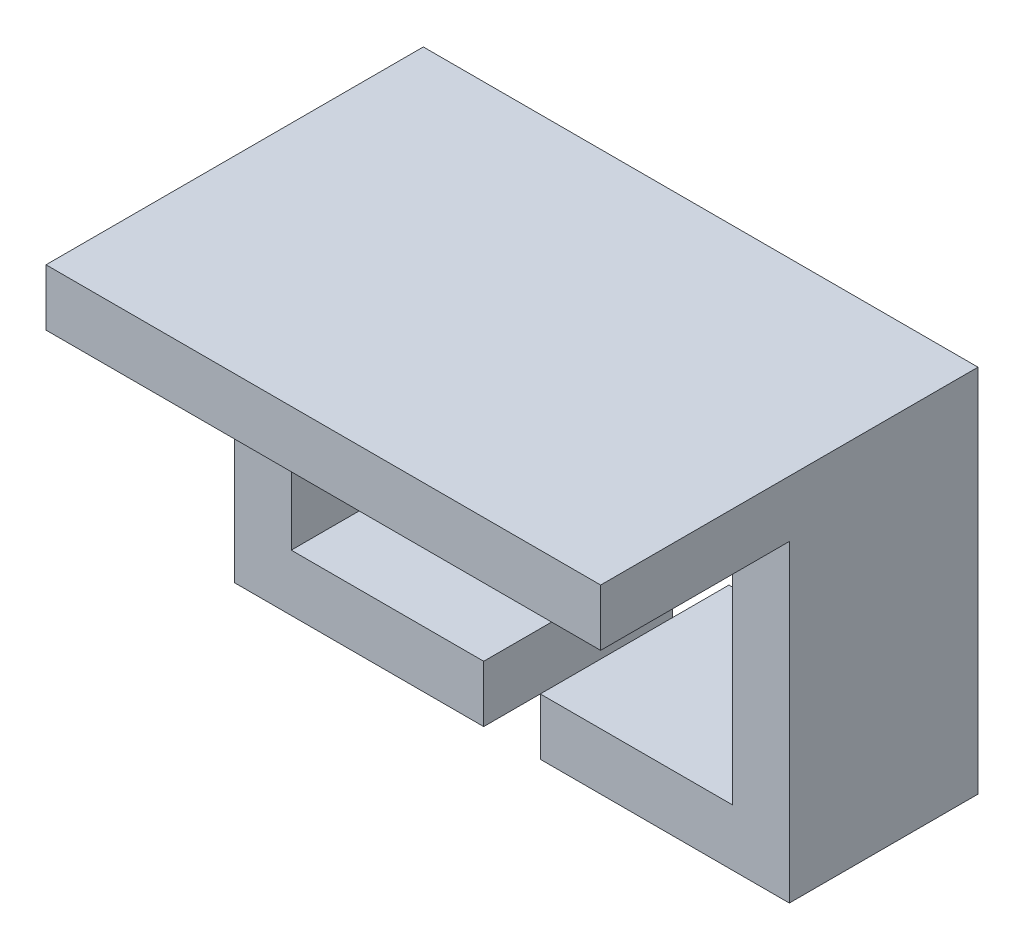
ISO-10303-21;
HEADER;
FILE_DESCRIPTION(('STEP AP214'),'2;1');
FILE_NAME('part.step','',(''),(''),'','','');
FILE_SCHEMA(('AUTOMOTIVE_DESIGN { 1 0 10303 214 1 1 1 1 }'));
ENDSEC;
DATA;
#1=APPLICATION_CONTEXT('core data for automotive mechanical design processes');
#2=APPLICATION_PROTOCOL_DEFINITION('international standard','automotive_design',2000,#1);
#3=PRODUCT_CONTEXT('',#1,'mechanical');
#4=PRODUCT('Part','Part','',(#3));
#5=PRODUCT_RELATED_PRODUCT_CATEGORY('part','',(#4));
#6=PRODUCT_DEFINITION_FORMATION('','',#4);
#7=PRODUCT_DEFINITION_CONTEXT('part definition',#1,'design');
#8=PRODUCT_DEFINITION('design','',#6,#7);
#9=PRODUCT_DEFINITION_SHAPE('','',#8);
#10=(LENGTH_UNIT() NAMED_UNIT(*) SI_UNIT(.MILLI.,.METRE.));
#11=(NAMED_UNIT(*) PLANE_ANGLE_UNIT() SI_UNIT($,.RADIAN.));
#12=(NAMED_UNIT(*) SI_UNIT($,.STERADIAN.) SOLID_ANGLE_UNIT());
#13=UNCERTAINTY_MEASURE_WITH_UNIT(LENGTH_MEASURE(1.E-05),#10,'distance_accuracy_value','');
#14=(GEOMETRIC_REPRESENTATION_CONTEXT(3) GLOBAL_UNCERTAINTY_ASSIGNED_CONTEXT((#13)) GLOBAL_UNIT_ASSIGNED_CONTEXT((#10,
#11,#12)) REPRESENTATION_CONTEXT('',''));
#15=CARTESIAN_POINT('',(0.,0.,0.));
#16=DIRECTION('',(0.,0.,1.));
#17=DIRECTION('',(1.,0.,0.));
#18=AXIS2_PLACEMENT_3D('',#15,#16,#17);
#19=CARTESIAN_POINT('',(0.,0.,5.));
#20=DIRECTION('',(0.,0.,-1.));
#21=DIRECTION('',(-1.,0.,0.));
#22=AXIS2_PLACEMENT_3D('',#19,#20,#21);
#23=PLANE('',#22);
#24=DIRECTION('',(1.,0.,0.));
#25=VECTOR('',#24,1.);
#26=CARTESIAN_POINT('',(-7.35,3.4,5.));
#27=LINE('',#26,#25);
#28=CARTESIAN_POINT('',(-7.35,3.4,5.));
#29=VERTEX_POINT('',#28);
#30=CARTESIAN_POINT('',(-5.85,3.4,5.));
#31=VERTEX_POINT('',#30);
#32=EDGE_CURVE('E45',#29,#31,#27,.T.);
#33=ORIENTED_EDGE('',*,*,#32,.F.);
#34=DIRECTION('',(0.,-1.,0.));
#35=VECTOR('',#34,1.);
#36=CARTESIAN_POINT('',(-7.35,4.9,5.));
#37=LINE('',#36,#35);
#38=CARTESIAN_POINT('',(-7.35,-4.9,5.));
#39=VERTEX_POINT('',#38);
#40=EDGE_CURVE('E178',#29,#39,#37,.T.);
#41=ORIENTED_EDGE('',*,*,#40,.T.);
#42=DIRECTION('',(1.,0.,0.));
#43=VECTOR('',#42,1.);
#44=CARTESIAN_POINT('',(-7.35,-4.9,5.));
#45=LINE('',#44,#43);
#46=CARTESIAN_POINT('',(-0.749999999999999,-4.9,5.));
#47=VERTEX_POINT('',#46);
#48=EDGE_CURVE('E180',#39,#47,#45,.T.);
#49=ORIENTED_EDGE('',*,*,#48,.T.);
#50=DIRECTION('',(0.,1.,0.));
#51=VECTOR('',#50,1.);
#52=CARTESIAN_POINT('',(-0.749999999999999,-3.4,5.));
#53=LINE('',#52,#51);
#54=CARTESIAN_POINT('',(-0.749999999999999,-3.4,5.));
#55=VERTEX_POINT('',#54);
#56=EDGE_CURVE('E182',#47,#55,#53,.T.);
#57=ORIENTED_EDGE('',*,*,#56,.T.);
#58=DIRECTION('',(-1.,0.,0.));
#59=VECTOR('',#58,1.);
#60=CARTESIAN_POINT('',(-5.85,-3.4,5.));
#61=LINE('',#60,#59);
#62=CARTESIAN_POINT('',(-5.85,-3.4,5.));
#63=VERTEX_POINT('',#62);
#64=EDGE_CURVE('E137',#55,#63,#61,.T.);
#65=ORIENTED_EDGE('',*,*,#64,.T.);
#66=DIRECTION('',(0.,1.,0.));
#67=VECTOR('',#66,1.);
#68=CARTESIAN_POINT('',(-5.85,3.4,5.));
#69=LINE('',#68,#67);
#70=EDGE_CURVE('E134',#63,#31,#69,.T.);
#71=ORIENTED_EDGE('',*,*,#70,.T.);
#72=EDGE_LOOP('',(#33,#41,#49,#57,#65,#71));
#73=FACE_BOUND('',#72,.T.);
#74=ADVANCED_FACE('F35',(#73),#23,.F.);
#75=CARTESIAN_POINT('',(5.85,3.4,5.));
#76=VERTEX_POINT('',#75);
#77=CARTESIAN_POINT('',(7.35,3.4,5.));
#78=VERTEX_POINT('',#77);
#79=EDGE_CURVE('E11',#76,#78,#27,.T.);
#80=ORIENTED_EDGE('',*,*,#79,.F.);
#81=DIRECTION('',(0.,-1.,0.));
#82=VECTOR('',#81,1.);
#83=CARTESIAN_POINT('',(5.85,3.4,5.));
#84=LINE('',#83,#82);
#85=CARTESIAN_POINT('',(5.85,-3.4,5.));
#86=VERTEX_POINT('',#85);
#87=EDGE_CURVE('E60',#76,#86,#84,.T.);
#88=ORIENTED_EDGE('',*,*,#87,.T.);
#89=DIRECTION('',(-1.,0.,0.));
#90=VECTOR('',#89,1.);
#91=CARTESIAN_POINT('',(0.750000000000001,-3.4,5.));
#92=LINE('',#91,#90);
#93=CARTESIAN_POINT('',(0.750000000000001,-3.4,5.));
#94=VERTEX_POINT('',#93);
#95=EDGE_CURVE('E170',#86,#94,#92,.T.);
#96=ORIENTED_EDGE('',*,*,#95,.T.);
#97=DIRECTION('',(0.,-1.,0.));
#98=VECTOR('',#97,1.);
#99=CARTESIAN_POINT('',(0.750000000000001,-3.4,5.));
#100=LINE('',#99,#98);
#101=CARTESIAN_POINT('',(0.750000000000001,-4.9,5.));
#102=VERTEX_POINT('',#101);
#103=EDGE_CURVE('E114',#94,#102,#100,.T.);
#104=ORIENTED_EDGE('',*,*,#103,.T.);
#105=DIRECTION('',(1.,0.,0.));
#106=VECTOR('',#105,1.);
#107=CARTESIAN_POINT('',(0.750000000000001,-4.9,5.));
#108=LINE('',#107,#106);
#109=CARTESIAN_POINT('',(7.35,-4.9,5.));
#110=VERTEX_POINT('',#109);
#111=EDGE_CURVE('E173',#102,#110,#108,.T.);
#112=ORIENTED_EDGE('',*,*,#111,.T.);
#113=DIRECTION('',(0.,1.,0.));
#114=VECTOR('',#113,1.);
#115=CARTESIAN_POINT('',(7.35,4.9,5.));
#116=LINE('',#115,#114);
#117=EDGE_CURVE('E175',#110,#78,#116,.T.);
#118=ORIENTED_EDGE('',*,*,#117,.T.);
#119=EDGE_LOOP('',(#80,#88,#96,#104,#112,#118));
#120=FACE_BOUND('',#119,.T.);
#121=ADVANCED_FACE('F251',(#120),#23,.F.);
#122=CARTESIAN_POINT('',(0.750000000000001,-3.4,5.));
#123=DIRECTION('',(0.,-1.,0.));
#124=DIRECTION('',(0.,0.,-1.));
#125=AXIS2_PLACEMENT_3D('',#122,#123,#124);
#126=PLANE('',#125);
#127=DIRECTION('',(-1.,0.,0.));
#128=VECTOR('',#127,1.);
#129=CARTESIAN_POINT('',(0.750000000000001,-3.4,0.));
#130=LINE('',#129,#128);
#131=CARTESIAN_POINT('',(5.85,-3.4,0.));
#132=VERTEX_POINT('',#131);
#133=CARTESIAN_POINT('',(0.750000000000001,-3.4,0.));
#134=VERTEX_POINT('',#133);
#135=EDGE_CURVE('E169',#132,#134,#130,.T.);
#136=ORIENTED_EDGE('',*,*,#135,.T.);
#137=DIRECTION('',(0.,0.,-1.));
#138=VECTOR('',#137,1.);
#139=CARTESIAN_POINT('',(0.750000000000001,-3.4,5.));
#140=LINE('',#139,#138);
#141=EDGE_CURVE('E39',#94,#134,#140,.T.);
#142=ORIENTED_EDGE('',*,*,#141,.F.);
#143=ORIENTED_EDGE('',*,*,#95,.F.);
#144=DIRECTION('',(0.,0.,-1.));
#145=VECTOR('',#144,1.);
#146=CARTESIAN_POINT('',(5.85,-3.4,5.));
#147=LINE('',#146,#145);
#148=EDGE_CURVE('E186',#86,#132,#147,.T.);
#149=ORIENTED_EDGE('',*,*,#148,.T.);
#150=EDGE_LOOP('',(#136,#142,#143,#149));
#151=FACE_BOUND('',#150,.T.);
#152=ADVANCED_FACE('F37',(#151),#126,.F.);
#153=CARTESIAN_POINT('',(0.750000000000001,-3.4,5.));
#154=DIRECTION('',(1.,0.,0.));
#155=DIRECTION('',(0.,1.,0.));
#156=AXIS2_PLACEMENT_3D('',#153,#154,#155);
#157=PLANE('',#156);
#158=DIRECTION('',(0.,-1.,0.));
#159=VECTOR('',#158,1.);
#160=CARTESIAN_POINT('',(0.750000000000001,-3.4,0.));
#161=LINE('',#160,#159);
#162=CARTESIAN_POINT('',(0.750000000000001,-4.9,0.));
#163=VERTEX_POINT('',#162);
#164=EDGE_CURVE('E189',#134,#163,#161,.T.);
#165=ORIENTED_EDGE('',*,*,#164,.T.);
#166=DIRECTION('',(0.,0.,-1.));
#167=VECTOR('',#166,1.);
#168=CARTESIAN_POINT('',(0.750000000000001,-4.9,5.));
#169=LINE('',#168,#167);
#170=EDGE_CURVE('E229',#102,#163,#169,.T.);
#171=ORIENTED_EDGE('',*,*,#170,.F.);
#172=ORIENTED_EDGE('',*,*,#103,.F.);
#173=ORIENTED_EDGE('',*,*,#141,.T.);
#174=EDGE_LOOP('',(#165,#171,#172,#173));
#175=FACE_BOUND('',#174,.T.);
#176=ADVANCED_FACE('F235',(#175),#157,.F.);
#177=CARTESIAN_POINT('',(0.750000000000001,-4.9,5.));
#178=DIRECTION('',(0.,1.,0.));
#179=DIRECTION('',(0.,0.,1.));
#180=AXIS2_PLACEMENT_3D('',#177,#178,#179);
#181=PLANE('',#180);
#182=DIRECTION('',(1.,0.,0.));
#183=VECTOR('',#182,1.);
#184=CARTESIAN_POINT('',(0.750000000000001,-4.9,0.));
#185=LINE('',#184,#183);
#186=CARTESIAN_POINT('',(7.35,-4.9,0.));
#187=VERTEX_POINT('',#186);
#188=EDGE_CURVE('E191',#163,#187,#185,.T.);
#189=ORIENTED_EDGE('',*,*,#188,.T.);
#190=DIRECTION('',(0.,0.,-1.));
#191=VECTOR('',#190,1.);
#192=CARTESIAN_POINT('',(7.35,-4.9,5.));
#193=LINE('',#192,#191);
#194=EDGE_CURVE('E227',#110,#187,#193,.T.);
#195=ORIENTED_EDGE('',*,*,#194,.F.);
#196=ORIENTED_EDGE('',*,*,#111,.F.);
#197=ORIENTED_EDGE('',*,*,#170,.T.);
#198=EDGE_LOOP('',(#189,#195,#196,#197));
#199=FACE_BOUND('',#198,.T.);
#200=ADVANCED_FACE('F244',(#199),#181,.F.);
#201=CARTESIAN_POINT('',(7.35,4.9,5.));
#202=DIRECTION('',(-1.,0.,0.));
#203=DIRECTION('',(0.,0.,1.));
#204=AXIS2_PLACEMENT_3D('',#201,#202,#203);
#205=PLANE('',#204);
#206=DIRECTION('',(0.,1.,0.));
#207=VECTOR('',#206,1.);
#208=CARTESIAN_POINT('',(7.35,4.9,0.));
#209=LINE('',#208,#207);
#210=CARTESIAN_POINT('',(7.35,4.9,0.));
#211=VERTEX_POINT('',#210);
#212=EDGE_CURVE('E193',#187,#211,#209,.T.);
#213=ORIENTED_EDGE('',*,*,#212,.T.);
#214=DIRECTION('',(0.,0.,-1.));
#215=VECTOR('',#214,1.);
#216=CARTESIAN_POINT('',(7.35,4.9,5.));
#217=LINE('',#216,#215);
#218=CARTESIAN_POINT('',(7.35,4.9,10.));
#219=VERTEX_POINT('',#218);
#220=EDGE_CURVE('E224',#219,#211,#217,.T.);
#221=ORIENTED_EDGE('',*,*,#220,.F.);
#222=DIRECTION('',(0.,-1.,0.));
#223=VECTOR('',#222,1.);
#224=CARTESIAN_POINT('',(7.35,4.9,10.));
#225=LINE('',#224,#223);
#226=CARTESIAN_POINT('',(7.35,3.4,10.));
#227=VERTEX_POINT('',#226);
#228=EDGE_CURVE('E159',#219,#227,#225,.T.);
#229=ORIENTED_EDGE('',*,*,#228,.T.);
#230=DIRECTION('',(0.,0.,-1.));
#231=VECTOR('',#230,1.);
#232=CARTESIAN_POINT('',(7.35,3.4,10.));
#233=LINE('',#232,#231);
#234=EDGE_CURVE('E166',#227,#78,#233,.T.);
#235=ORIENTED_EDGE('',*,*,#234,.T.);
#236=ORIENTED_EDGE('',*,*,#117,.F.);
#237=ORIENTED_EDGE('',*,*,#194,.T.);
#238=EDGE_LOOP('',(#213,#221,#229,#235,#236,#237));
#239=FACE_BOUND('',#238,.T.);
#240=ADVANCED_FACE('F247',(#239),#205,.F.);
#241=CARTESIAN_POINT('',(-7.35,4.9,5.));
#242=DIRECTION('',(0.,-1.,0.));
#243=DIRECTION('',(0.,0.,-1.));
#244=AXIS2_PLACEMENT_3D('',#241,#242,#243);
#245=PLANE('',#244);
#246=DIRECTION('',(-1.,0.,0.));
#247=VECTOR('',#246,1.);
#248=CARTESIAN_POINT('',(-7.35,4.9,0.));
#249=LINE('',#248,#247);
#250=CARTESIAN_POINT('',(-7.35,4.9,0.));
#251=VERTEX_POINT('',#250);
#252=EDGE_CURVE('E195',#211,#251,#249,.T.);
#253=ORIENTED_EDGE('',*,*,#252,.T.);
#254=DIRECTION('',(0.,0.,-1.));
#255=VECTOR('',#254,1.);
#256=CARTESIAN_POINT('',(-7.35,4.9,5.));
#257=LINE('',#256,#255);
#258=CARTESIAN_POINT('',(-7.35,4.9,10.));
#259=VERTEX_POINT('',#258);
#260=EDGE_CURVE('E221',#259,#251,#257,.T.);
#261=ORIENTED_EDGE('',*,*,#260,.F.);
#262=DIRECTION('',(1.,0.,0.));
#263=VECTOR('',#262,1.);
#264=CARTESIAN_POINT('',(-7.35,4.9,10.));
#265=LINE('',#264,#263);
#266=EDGE_CURVE('E287',#259,#219,#265,.T.);
#267=ORIENTED_EDGE('',*,*,#266,.T.);
#268=ORIENTED_EDGE('',*,*,#220,.T.);
#269=EDGE_LOOP('',(#253,#261,#267,#268));
#270=FACE_BOUND('',#269,.T.);
#271=ADVANCED_FACE('F286',(#270),#245,.F.);
#272=CARTESIAN_POINT('',(-7.35,4.9,5.));
#273=DIRECTION('',(1.,0.,0.));
#274=DIRECTION('',(0.,1.,0.));
#275=AXIS2_PLACEMENT_3D('',#272,#273,#274);
#276=PLANE('',#275);
#277=DIRECTION('',(0.,-1.,0.));
#278=VECTOR('',#277,1.);
#279=CARTESIAN_POINT('',(-7.35,4.9,0.));
#280=LINE('',#279,#278);
#281=CARTESIAN_POINT('',(-7.35,-4.9,0.));
#282=VERTEX_POINT('',#281);
#283=EDGE_CURVE('E197',#251,#282,#280,.T.);
#284=ORIENTED_EDGE('',*,*,#283,.T.);
#285=DIRECTION('',(0.,0.,-1.));
#286=VECTOR('',#285,1.);
#287=CARTESIAN_POINT('',(-7.35,-4.9,5.));
#288=LINE('',#287,#286);
#289=EDGE_CURVE('E218',#39,#282,#288,.T.);
#290=ORIENTED_EDGE('',*,*,#289,.F.);
#291=ORIENTED_EDGE('',*,*,#40,.F.);
#292=DIRECTION('',(0.,0.,-1.));
#293=VECTOR('',#292,1.);
#294=CARTESIAN_POINT('',(-7.35,3.4,10.));
#295=LINE('',#294,#293);
#296=CARTESIAN_POINT('',(-7.35,3.4,10.));
#297=VERTEX_POINT('',#296);
#298=EDGE_CURVE('E156',#297,#29,#295,.T.);
#299=ORIENTED_EDGE('',*,*,#298,.F.);
#300=DIRECTION('',(0.,-1.,0.));
#301=VECTOR('',#300,1.);
#302=CARTESIAN_POINT('',(-7.35,4.9,10.));
#303=LINE('',#302,#301);
#304=EDGE_CURVE('E163',#259,#297,#303,.T.);
#305=ORIENTED_EDGE('',*,*,#304,.F.);
#306=ORIENTED_EDGE('',*,*,#260,.T.);
#307=EDGE_LOOP('',(#284,#290,#291,#299,#305,#306));
#308=FACE_BOUND('',#307,.T.);
#309=ADVANCED_FACE('F293',(#308),#276,.F.);
#310=CARTESIAN_POINT('',(-7.35,-4.9,5.));
#311=DIRECTION('',(0.,1.,0.));
#312=DIRECTION('',(0.,0.,1.));
#313=AXIS2_PLACEMENT_3D('',#310,#311,#312);
#314=PLANE('',#313);
#315=DIRECTION('',(1.,0.,0.));
#316=VECTOR('',#315,1.);
#317=CARTESIAN_POINT('',(-7.35,-4.9,0.));
#318=LINE('',#317,#316);
#319=CARTESIAN_POINT('',(-0.749999999999999,-4.9,0.));
#320=VERTEX_POINT('',#319);
#321=EDGE_CURVE('E199',#282,#320,#318,.T.);
#322=ORIENTED_EDGE('',*,*,#321,.T.);
#323=DIRECTION('',(0.,0.,-1.));
#324=VECTOR('',#323,1.);
#325=CARTESIAN_POINT('',(-0.749999999999999,-4.9,5.));
#326=LINE('',#325,#324);
#327=EDGE_CURVE('E215',#47,#320,#326,.T.);
#328=ORIENTED_EDGE('',*,*,#327,.F.);
#329=ORIENTED_EDGE('',*,*,#48,.F.);
#330=ORIENTED_EDGE('',*,*,#289,.T.);
#331=EDGE_LOOP('',(#322,#328,#329,#330));
#332=FACE_BOUND('',#331,.T.);
#333=ADVANCED_FACE('F296',(#332),#314,.F.);
#334=CARTESIAN_POINT('',(-0.749999999999999,-3.4,5.));
#335=DIRECTION('',(-1.,0.,0.));
#336=DIRECTION('',(0.,-1.,0.));
#337=AXIS2_PLACEMENT_3D('',#334,#335,#336);
#338=PLANE('',#337);
#339=DIRECTION('',(0.,1.,0.));
#340=VECTOR('',#339,1.);
#341=CARTESIAN_POINT('',(-0.749999999999999,-3.4,0.));
#342=LINE('',#341,#340);
#343=CARTESIAN_POINT('',(-0.749999999999999,-3.4,0.));
#344=VERTEX_POINT('',#343);
#345=EDGE_CURVE('E201',#320,#344,#342,.T.);
#346=ORIENTED_EDGE('',*,*,#345,.T.);
#347=DIRECTION('',(0.,0.,-1.));
#348=VECTOR('',#347,1.);
#349=CARTESIAN_POINT('',(-0.749999999999999,-3.4,5.));
#350=LINE('',#349,#348);
#351=EDGE_CURVE('E212',#55,#344,#350,.T.);
#352=ORIENTED_EDGE('',*,*,#351,.F.);
#353=ORIENTED_EDGE('',*,*,#56,.F.);
#354=ORIENTED_EDGE('',*,*,#327,.T.);
#355=EDGE_LOOP('',(#346,#352,#353,#354));
#356=FACE_BOUND('',#355,.T.);
#357=ADVANCED_FACE('F302',(#356),#338,.F.);
#358=CARTESIAN_POINT('',(-5.85,-3.4,5.));
#359=DIRECTION('',(0.,-1.,0.));
#360=DIRECTION('',(0.,0.,-1.));
#361=AXIS2_PLACEMENT_3D('',#358,#359,#360);
#362=PLANE('',#361);
#363=DIRECTION('',(-1.,0.,0.));
#364=VECTOR('',#363,1.);
#365=CARTESIAN_POINT('',(-5.85,-3.4,0.));
#366=LINE('',#365,#364);
#367=CARTESIAN_POINT('',(-5.85,-3.4,0.));
#368=VERTEX_POINT('',#367);
#369=EDGE_CURVE('E203',#344,#368,#366,.T.);
#370=ORIENTED_EDGE('',*,*,#369,.T.);
#371=DIRECTION('',(0.,0.,-1.));
#372=VECTOR('',#371,1.);
#373=CARTESIAN_POINT('',(-5.85,-3.4,5.));
#374=LINE('',#373,#372);
#375=EDGE_CURVE('E149',#63,#368,#374,.T.);
#376=ORIENTED_EDGE('',*,*,#375,.F.);
#377=ORIENTED_EDGE('',*,*,#64,.F.);
#378=ORIENTED_EDGE('',*,*,#351,.T.);
#379=EDGE_LOOP('',(#370,#376,#377,#378));
#380=FACE_BOUND('',#379,.T.);
#381=ADVANCED_FACE('F305',(#380),#362,.F.);
#382=CARTESIAN_POINT('',(-5.85,3.4,5.));
#383=DIRECTION('',(-1.,0.,0.));
#384=DIRECTION('',(0.,-1.,0.));
#385=AXIS2_PLACEMENT_3D('',#382,#383,#384);
#386=PLANE('',#385);
#387=DIRECTION('',(0.,1.,0.));
#388=VECTOR('',#387,1.);
#389=CARTESIAN_POINT('',(-5.85,3.4,0.));
#390=LINE('',#389,#388);
#391=CARTESIAN_POINT('',(-5.85,3.4,0.));
#392=VERTEX_POINT('',#391);
#393=EDGE_CURVE('E146',#368,#392,#390,.T.);
#394=ORIENTED_EDGE('',*,*,#393,.T.);
#395=DIRECTION('',(0.,0.,-1.));
#396=VECTOR('',#395,1.);
#397=CARTESIAN_POINT('',(-5.85,3.4,5.));
#398=LINE('',#397,#396);
#399=EDGE_CURVE('E143',#31,#392,#398,.T.);
#400=ORIENTED_EDGE('',*,*,#399,.F.);
#401=ORIENTED_EDGE('',*,*,#70,.F.);
#402=ORIENTED_EDGE('',*,*,#375,.T.);
#403=EDGE_LOOP('',(#394,#400,#401,#402));
#404=FACE_BOUND('',#403,.T.);
#405=ADVANCED_FACE('F144',(#404),#386,.F.);
#406=CARTESIAN_POINT('',(-5.85,3.4,5.));
#407=DIRECTION('',(0.,1.,0.));
#408=DIRECTION('',(0.,0.,1.));
#409=AXIS2_PLACEMENT_3D('',#406,#407,#408);
#410=PLANE('',#409);
#411=DIRECTION('',(1.,0.,0.));
#412=VECTOR('',#411,1.);
#413=CARTESIAN_POINT('',(-5.85,3.4,0.));
#414=LINE('',#413,#412);
#415=CARTESIAN_POINT('',(5.85,3.4,0.));
#416=VERTEX_POINT('',#415);
#417=EDGE_CURVE('E206',#392,#416,#414,.T.);
#418=ORIENTED_EDGE('',*,*,#417,.T.);
#419=DIRECTION('',(0.,0.,-1.));
#420=VECTOR('',#419,1.);
#421=CARTESIAN_POINT('',(5.85,3.4,5.));
#422=LINE('',#421,#420);
#423=EDGE_CURVE('E150',#76,#416,#422,.T.);
#424=ORIENTED_EDGE('',*,*,#423,.F.);
#425=ORIENTED_EDGE('',*,*,#79,.T.);
#426=ORIENTED_EDGE('',*,*,#234,.F.);
#427=DIRECTION('',(1.,0.,0.));
#428=VECTOR('',#427,1.);
#429=CARTESIAN_POINT('',(-7.35,3.4,10.));
#430=LINE('',#429,#428);
#431=EDGE_CURVE('E157',#297,#227,#430,.T.);
#432=ORIENTED_EDGE('',*,*,#431,.F.);
#433=ORIENTED_EDGE('',*,*,#298,.T.);
#434=ORIENTED_EDGE('',*,*,#32,.T.);
#435=ORIENTED_EDGE('',*,*,#399,.T.);
#436=EDGE_LOOP('',(#418,#424,#425,#426,#432,#433,#434,#435));
#437=FACE_BOUND('',#436,.T.);
#438=ADVANCED_FACE('F153',(#437),#410,.F.);
#439=CARTESIAN_POINT('',(5.85,3.4,5.));
#440=DIRECTION('',(1.,0.,0.));
#441=DIRECTION('',(0.,0.,-1.));
#442=AXIS2_PLACEMENT_3D('',#439,#440,#441);
#443=PLANE('',#442);
#444=DIRECTION('',(0.,-1.,0.));
#445=VECTOR('',#444,1.);
#446=CARTESIAN_POINT('',(5.85,3.4,0.));
#447=LINE('',#446,#445);
#448=EDGE_CURVE('E105',#416,#132,#447,.T.);
#449=ORIENTED_EDGE('',*,*,#448,.T.);
#450=ORIENTED_EDGE('',*,*,#148,.F.);
#451=ORIENTED_EDGE('',*,*,#87,.F.);
#452=ORIENTED_EDGE('',*,*,#423,.T.);
#453=EDGE_LOOP('',(#449,#450,#451,#452));
#454=FACE_BOUND('',#453,.T.);
#455=ADVANCED_FACE('F254',(#454),#443,.F.);
#456=CARTESIAN_POINT('',(0.,0.,0.));
#457=DIRECTION('',(0.,0.,-1.));
#458=DIRECTION('',(-1.,0.,0.));
#459=AXIS2_PLACEMENT_3D('',#456,#457,#458);
#460=PLANE('',#459);
#461=ORIENTED_EDGE('',*,*,#135,.F.);
#462=ORIENTED_EDGE('',*,*,#448,.F.);
#463=ORIENTED_EDGE('',*,*,#417,.F.);
#464=ORIENTED_EDGE('',*,*,#393,.F.);
#465=ORIENTED_EDGE('',*,*,#369,.F.);
#466=ORIENTED_EDGE('',*,*,#345,.F.);
#467=ORIENTED_EDGE('',*,*,#321,.F.);
#468=ORIENTED_EDGE('',*,*,#283,.F.);
#469=ORIENTED_EDGE('',*,*,#252,.F.);
#470=ORIENTED_EDGE('',*,*,#212,.F.);
#471=ORIENTED_EDGE('',*,*,#188,.F.);
#472=ORIENTED_EDGE('',*,*,#164,.F.);
#473=EDGE_LOOP('',(#461,#462,#463,#464,#465,#466,#467,#468,#469,#470,#471,#472));
#474=FACE_BOUND('',#473,.T.);
#475=ADVANCED_FACE('F240',(#474),#460,.T.);
#476=CARTESIAN_POINT('',(0.,0.,10.));
#477=DIRECTION('',(0.,0.,-1.));
#478=DIRECTION('',(-1.,0.,0.));
#479=AXIS2_PLACEMENT_3D('',#476,#477,#478);
#480=PLANE('',#479);
#481=ORIENTED_EDGE('',*,*,#431,.T.);
#482=ORIENTED_EDGE('',*,*,#228,.F.);
#483=ORIENTED_EDGE('',*,*,#266,.F.);
#484=ORIENTED_EDGE('',*,*,#304,.T.);
#485=EDGE_LOOP('',(#481,#482,#483,#484));
#486=FACE_BOUND('',#485,.T.);
#487=ADVANCED_FACE('F261',(#486),#480,.F.);
#488=CLOSED_SHELL('',(#74,#121,#152,#176,#200,#240,#271,#309,#333,#357,#381,#405,#438,#455,#475,#487));
#489=MANIFOLD_SOLID_BREP('B2',#488);
#490=ADVANCED_BREP_SHAPE_REPRESENTATION('',(#18,#489),#14);
#491=SHAPE_DEFINITION_REPRESENTATION(#9,#490);
ENDSEC;
END-ISO-10303-21;
